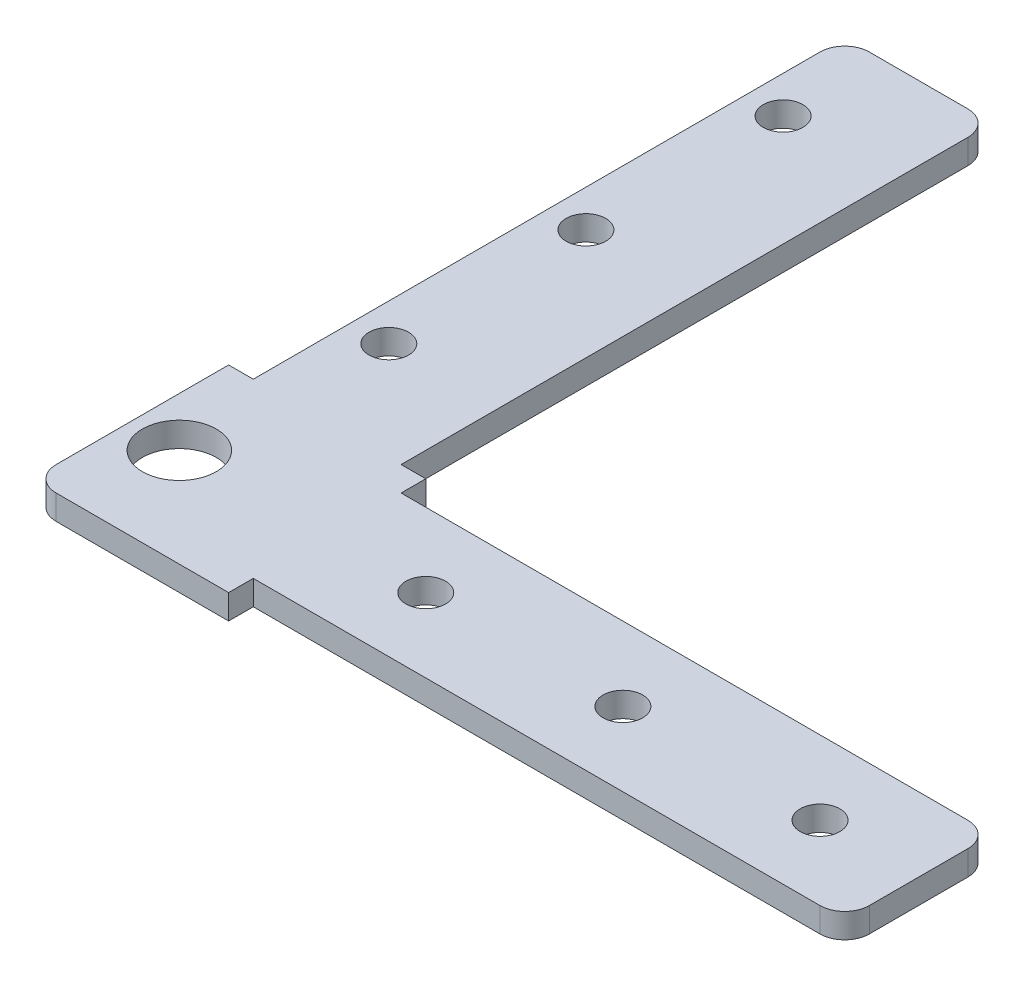
ISO-10303-21;
HEADER;
FILE_DESCRIPTION(('STEP AP214'),'2;1');
FILE_NAME('part.step','',(''),(''),'','','');
FILE_SCHEMA(('AUTOMOTIVE_DESIGN { 1 0 10303 214 1 1 1 1 }'));
ENDSEC;
DATA;
#1=APPLICATION_CONTEXT('core data for automotive mechanical design processes');
#2=APPLICATION_PROTOCOL_DEFINITION('international standard','automotive_design',2000,#1);
#3=PRODUCT_CONTEXT('',#1,'mechanical');
#4=PRODUCT('Part','Part','',(#3));
#5=PRODUCT_RELATED_PRODUCT_CATEGORY('part','',(#4));
#6=PRODUCT_DEFINITION_FORMATION('','',#4);
#7=PRODUCT_DEFINITION_CONTEXT('part definition',#1,'design');
#8=PRODUCT_DEFINITION('design','',#6,#7);
#9=PRODUCT_DEFINITION_SHAPE('','',#8);
#10=(LENGTH_UNIT() NAMED_UNIT(*) SI_UNIT(.MILLI.,.METRE.));
#11=(NAMED_UNIT(*) PLANE_ANGLE_UNIT() SI_UNIT($,.RADIAN.));
#12=(NAMED_UNIT(*) SI_UNIT($,.STERADIAN.) SOLID_ANGLE_UNIT());
#13=UNCERTAINTY_MEASURE_WITH_UNIT(LENGTH_MEASURE(1.E-05),#10,'distance_accuracy_value','');
#14=(GEOMETRIC_REPRESENTATION_CONTEXT(3) GLOBAL_UNCERTAINTY_ASSIGNED_CONTEXT((#13)) GLOBAL_UNIT_ASSIGNED_CONTEXT((#10,
#11,#12)) REPRESENTATION_CONTEXT('',''));
#15=CARTESIAN_POINT('',(0.,0.,0.));
#16=DIRECTION('',(0.,0.,1.));
#17=DIRECTION('',(1.,0.,0.));
#18=AXIS2_PLACEMENT_3D('',#15,#16,#17);
#19=CARTESIAN_POINT('',(25.4,3.175,0.));
#20=DIRECTION('',(0.,0.,-1.));
#21=DIRECTION('',(-1.,0.,0.));
#22=AXIS2_PLACEMENT_3D('',#19,#20,#21);
#23=PLANE('',#22);
#24=DIRECTION('',(1.,0.,0.));
#25=VECTOR('',#24,1.);
#26=CARTESIAN_POINT('',(25.4,3.175,0.));
#27=LINE('',#26,#25);
#28=CARTESIAN_POINT('',(3.175,3.175,0.));
#29=VERTEX_POINT('',#28);
#30=CARTESIAN_POINT('',(25.4,3.175,0.));
#31=VERTEX_POINT('',#30);
#32=EDGE_CURVE('E161',#29,#31,#27,.T.);
#33=ORIENTED_EDGE('',*,*,#32,.F.);
#34=DIRECTION('',(0.,-1.,0.));
#35=VECTOR('',#34,1.);
#36=CARTESIAN_POINT('',(3.175,3.175,0.));
#37=LINE('',#36,#35);
#38=CARTESIAN_POINT('',(3.175,0.,0.));
#39=VERTEX_POINT('',#38);
#40=EDGE_CURVE('E240',#29,#39,#37,.T.);
#41=ORIENTED_EDGE('',*,*,#40,.T.);
#42=DIRECTION('',(1.,0.,0.));
#43=VECTOR('',#42,1.);
#44=CARTESIAN_POINT('',(25.4,0.,0.));
#45=LINE('',#44,#43);
#46=CARTESIAN_POINT('',(25.4,0.,0.));
#47=VERTEX_POINT('',#46);
#48=EDGE_CURVE('E187',#39,#47,#45,.T.);
#49=ORIENTED_EDGE('',*,*,#48,.T.);
#50=DIRECTION('',(0.,-1.,0.));
#51=VECTOR('',#50,1.);
#52=CARTESIAN_POINT('',(25.4,3.175,0.));
#53=LINE('',#52,#51);
#54=EDGE_CURVE('E179',#31,#47,#53,.T.);
#55=ORIENTED_EDGE('',*,*,#54,.F.);
#56=EDGE_LOOP('',(#33,#41,#49,#55));
#57=FACE_BOUND('',#56,.T.);
#58=ADVANCED_FACE('F40',(#57),#23,.F.);
#59=CARTESIAN_POINT('',(25.4,3.175,-3.175));
#60=DIRECTION('',(-1.,0.,0.));
#61=DIRECTION('',(0.,0.,1.));
#62=AXIS2_PLACEMENT_3D('',#59,#60,#61);
#63=PLANE('',#62);
#64=DIRECTION('',(0.,0.,-1.));
#65=VECTOR('',#64,1.);
#66=CARTESIAN_POINT('',(25.4,0.,-3.175));
#67=LINE('',#66,#65);
#68=CARTESIAN_POINT('',(25.4,0.,-3.175));
#69=VERTEX_POINT('',#68);
#70=EDGE_CURVE('E342',#47,#69,#67,.T.);
#71=ORIENTED_EDGE('',*,*,#70,.T.);
#72=DIRECTION('',(0.,-1.,0.));
#73=VECTOR('',#72,1.);
#74=CARTESIAN_POINT('',(25.4,3.175,-3.175));
#75=LINE('',#74,#73);
#76=CARTESIAN_POINT('',(25.4,3.175,-3.175));
#77=VERTEX_POINT('',#76);
#78=EDGE_CURVE('E181',#77,#69,#75,.T.);
#79=ORIENTED_EDGE('',*,*,#78,.F.);
#80=DIRECTION('',(0.,0.,-1.));
#81=VECTOR('',#80,1.);
#82=CARTESIAN_POINT('',(25.4,3.175,-3.175));
#83=LINE('',#82,#81);
#84=EDGE_CURVE('E165',#31,#77,#83,.T.);
#85=ORIENTED_EDGE('',*,*,#84,.F.);
#86=ORIENTED_EDGE('',*,*,#54,.T.);
#87=EDGE_LOOP('',(#71,#79,#85,#86));
#88=FACE_BOUND('',#87,.T.);
#89=ADVANCED_FACE('F178',(#88),#63,.F.);
#90=CARTESIAN_POINT('',(101.6,3.175,-3.175));
#91=DIRECTION('',(0.,0.,-1.));
#92=DIRECTION('',(-1.,0.,0.));
#93=AXIS2_PLACEMENT_3D('',#90,#91,#92);
#94=PLANE('',#93);
#95=DIRECTION('',(1.,0.,0.));
#96=VECTOR('',#95,1.);
#97=CARTESIAN_POINT('',(101.6,0.,-3.175));
#98=LINE('',#97,#96);
#99=CARTESIAN_POINT('',(98.425,0.,-3.175));
#100=VERTEX_POINT('',#99);
#101=EDGE_CURVE('E338',#69,#100,#98,.T.);
#102=ORIENTED_EDGE('',*,*,#101,.T.);
#103=DIRECTION('',(0.,-1.,0.));
#104=VECTOR('',#103,1.);
#105=CARTESIAN_POINT('',(98.425,3.175,-3.175));
#106=LINE('',#105,#104);
#107=CARTESIAN_POINT('',(98.425,3.175,-3.175));
#108=VERTEX_POINT('',#107);
#109=EDGE_CURVE('E220',#100,#108,#106,.F.);
#110=ORIENTED_EDGE('',*,*,#109,.T.);
#111=DIRECTION('',(1.,0.,0.));
#112=VECTOR('',#111,1.);
#113=CARTESIAN_POINT('',(101.6,3.175,-3.175));
#114=LINE('',#113,#112);
#115=EDGE_CURVE('E184',#77,#108,#114,.T.);
#116=ORIENTED_EDGE('',*,*,#115,.F.);
#117=ORIENTED_EDGE('',*,*,#78,.T.);
#118=EDGE_LOOP('',(#102,#110,#116,#117));
#119=FACE_BOUND('',#118,.T.);
#120=ADVANCED_FACE('F468',(#119),#94,.F.);
#121=CARTESIAN_POINT('',(101.6,3.175,-22.225));
#122=DIRECTION('',(-1.,0.,0.));
#123=DIRECTION('',(0.,0.,1.));
#124=AXIS2_PLACEMENT_3D('',#121,#122,#123);
#125=PLANE('',#124);
#126=DIRECTION('',(0.,0.,-1.));
#127=VECTOR('',#126,1.);
#128=CARTESIAN_POINT('',(101.6,3.175,-22.225));
#129=LINE('',#128,#127);
#130=CARTESIAN_POINT('',(101.6,3.175,-6.35));
#131=VERTEX_POINT('',#130);
#132=CARTESIAN_POINT('',(101.6,3.175,-19.05));
#133=VERTEX_POINT('',#132);
#134=EDGE_CURVE('E365',#131,#133,#129,.T.);
#135=ORIENTED_EDGE('',*,*,#134,.F.);
#136=DIRECTION('',(0.,-1.,0.));
#137=VECTOR('',#136,1.);
#138=CARTESIAN_POINT('',(101.6,3.175,-6.35));
#139=LINE('',#138,#137);
#140=CARTESIAN_POINT('',(101.6,0.,-6.35));
#141=VERTEX_POINT('',#140);
#142=EDGE_CURVE('E195',#131,#141,#139,.T.);
#143=ORIENTED_EDGE('',*,*,#142,.T.);
#144=DIRECTION('',(0.,0.,-1.));
#145=VECTOR('',#144,1.);
#146=CARTESIAN_POINT('',(101.6,0.,-22.225));
#147=LINE('',#146,#145);
#148=CARTESIAN_POINT('',(101.6,0.,-19.05));
#149=VERTEX_POINT('',#148);
#150=EDGE_CURVE('E332',#141,#149,#147,.T.);
#151=ORIENTED_EDGE('',*,*,#150,.T.);
#152=DIRECTION('',(0.,-1.,0.));
#153=VECTOR('',#152,1.);
#154=CARTESIAN_POINT('',(101.6,3.175,-19.05));
#155=LINE('',#154,#153);
#156=EDGE_CURVE('E190',#149,#133,#155,.F.);
#157=ORIENTED_EDGE('',*,*,#156,.T.);
#158=EDGE_LOOP('',(#135,#143,#151,#157));
#159=FACE_BOUND('',#158,.T.);
#160=ADVANCED_FACE('F506',(#159),#125,.F.);
#161=CARTESIAN_POINT('',(25.4,3.175,-22.225));
#162=DIRECTION('',(0.,0.,1.));
#163=DIRECTION('',(1.,0.,0.));
#164=AXIS2_PLACEMENT_3D('',#161,#162,#163);
#165=PLANE('',#164);
#166=DIRECTION('',(-1.,0.,0.));
#167=VECTOR('',#166,1.);
#168=CARTESIAN_POINT('',(25.4,3.175,-22.225));
#169=LINE('',#168,#167);
#170=CARTESIAN_POINT('',(98.425,3.175,-22.225));
#171=VERTEX_POINT('',#170);
#172=CARTESIAN_POINT('',(25.4,3.175,-22.225));
#173=VERTEX_POINT('',#172);
#174=EDGE_CURVE('E362',#171,#173,#169,.T.);
#175=ORIENTED_EDGE('',*,*,#174,.F.);
#176=DIRECTION('',(0.,-1.,0.));
#177=VECTOR('',#176,1.);
#178=CARTESIAN_POINT('',(98.425,3.175,-22.225));
#179=LINE('',#178,#177);
#180=CARTESIAN_POINT('',(98.425,0.,-22.225));
#181=VERTEX_POINT('',#180);
#182=EDGE_CURVE('E236',#171,#181,#179,.T.);
#183=ORIENTED_EDGE('',*,*,#182,.T.);
#184=DIRECTION('',(-1.,0.,0.));
#185=VECTOR('',#184,1.);
#186=CARTESIAN_POINT('',(25.4,0.,-22.225));
#187=LINE('',#186,#185);
#188=CARTESIAN_POINT('',(25.4,0.,-22.225));
#189=VERTEX_POINT('',#188);
#190=EDGE_CURVE('E328',#181,#189,#187,.T.);
#191=ORIENTED_EDGE('',*,*,#190,.T.);
#192=DIRECTION('',(0.,-1.,0.));
#193=VECTOR('',#192,1.);
#194=CARTESIAN_POINT('',(25.4,3.175,-22.225));
#195=LINE('',#194,#193);
#196=EDGE_CURVE('E198',#173,#189,#195,.T.);
#197=ORIENTED_EDGE('',*,*,#196,.F.);
#198=EDGE_LOOP('',(#175,#183,#191,#197));
#199=FACE_BOUND('',#198,.T.);
#200=ADVANCED_FACE('F510',(#199),#165,.F.);
#201=CARTESIAN_POINT('',(25.4,3.175,-25.4));
#202=DIRECTION('',(-1.,0.,0.));
#203=DIRECTION('',(0.,0.,1.));
#204=AXIS2_PLACEMENT_3D('',#201,#202,#203);
#205=PLANE('',#204);
#206=DIRECTION('',(0.,0.,-1.));
#207=VECTOR('',#206,1.);
#208=CARTESIAN_POINT('',(25.4,0.,-25.4));
#209=LINE('',#208,#207);
#210=CARTESIAN_POINT('',(25.4,0.,-25.4));
#211=VERTEX_POINT('',#210);
#212=EDGE_CURVE('E322',#189,#211,#209,.T.);
#213=ORIENTED_EDGE('',*,*,#212,.T.);
#214=DIRECTION('',(0.,-1.,0.));
#215=VECTOR('',#214,1.);
#216=CARTESIAN_POINT('',(25.4,3.175,-25.4));
#217=LINE('',#216,#215);
#218=CARTESIAN_POINT('',(25.4,3.175,-25.4));
#219=VERTEX_POINT('',#218);
#220=EDGE_CURVE('E311',#219,#211,#217,.T.);
#221=ORIENTED_EDGE('',*,*,#220,.F.);
#222=DIRECTION('',(0.,0.,-1.));
#223=VECTOR('',#222,1.);
#224=CARTESIAN_POINT('',(25.4,3.175,-25.4));
#225=LINE('',#224,#223);
#226=EDGE_CURVE('E323',#173,#219,#225,.T.);
#227=ORIENTED_EDGE('',*,*,#226,.F.);
#228=ORIENTED_EDGE('',*,*,#196,.T.);
#229=EDGE_LOOP('',(#213,#221,#227,#228));
#230=FACE_BOUND('',#229,.T.);
#231=ADVANCED_FACE('F320',(#230),#205,.F.);
#232=CARTESIAN_POINT('',(22.225,3.175,-25.4));
#233=DIRECTION('',(0.,0.,1.));
#234=DIRECTION('',(1.,0.,0.));
#235=AXIS2_PLACEMENT_3D('',#232,#233,#234);
#236=PLANE('',#235);
#237=DIRECTION('',(-1.,0.,0.));
#238=VECTOR('',#237,1.);
#239=CARTESIAN_POINT('',(22.225,0.,-25.4));
#240=LINE('',#239,#238);
#241=CARTESIAN_POINT('',(22.225,0.,-25.4));
#242=VERTEX_POINT('',#241);
#243=EDGE_CURVE('E291',#211,#242,#240,.T.);
#244=ORIENTED_EDGE('',*,*,#243,.T.);
#245=DIRECTION('',(0.,-1.,0.));
#246=VECTOR('',#245,1.);
#247=CARTESIAN_POINT('',(22.225,3.175,-25.4));
#248=LINE('',#247,#246);
#249=CARTESIAN_POINT('',(22.225,3.175,-25.4));
#250=VERTEX_POINT('',#249);
#251=EDGE_CURVE('E308',#250,#242,#248,.T.);
#252=ORIENTED_EDGE('',*,*,#251,.F.);
#253=DIRECTION('',(-1.,0.,0.));
#254=VECTOR('',#253,1.);
#255=CARTESIAN_POINT('',(22.225,3.175,-25.4));
#256=LINE('',#255,#254);
#257=EDGE_CURVE('E267',#219,#250,#256,.T.);
#258=ORIENTED_EDGE('',*,*,#257,.F.);
#259=ORIENTED_EDGE('',*,*,#220,.T.);
#260=EDGE_LOOP('',(#244,#252,#258,#259));
#261=FACE_BOUND('',#260,.T.);
#262=ADVANCED_FACE('F512',(#261),#236,.F.);
#263=CARTESIAN_POINT('',(22.225,3.175,-101.6));
#264=DIRECTION('',(-1.,0.,0.));
#265=DIRECTION('',(0.,0.,1.));
#266=AXIS2_PLACEMENT_3D('',#263,#264,#265);
#267=PLANE('',#266);
#268=DIRECTION('',(0.,0.,-1.));
#269=VECTOR('',#268,1.);
#270=CARTESIAN_POINT('',(22.225,0.,-101.6));
#271=LINE('',#270,#269);
#272=CARTESIAN_POINT('',(22.225,0.,-98.425));
#273=VERTEX_POINT('',#272);
#274=EDGE_CURVE('E262',#242,#273,#271,.T.);
#275=ORIENTED_EDGE('',*,*,#274,.T.);
#276=DIRECTION('',(0.,-1.,0.));
#277=VECTOR('',#276,1.);
#278=CARTESIAN_POINT('',(22.225,3.175,-98.425));
#279=LINE('',#278,#277);
#280=CARTESIAN_POINT('',(22.225,3.175,-98.425));
#281=VERTEX_POINT('',#280);
#282=EDGE_CURVE('E49',#273,#281,#279,.F.);
#283=ORIENTED_EDGE('',*,*,#282,.T.);
#284=DIRECTION('',(0.,0.,-1.));
#285=VECTOR('',#284,1.);
#286=CARTESIAN_POINT('',(22.225,3.175,-101.6));
#287=LINE('',#286,#285);
#288=EDGE_CURVE('E260',#250,#281,#287,.T.);
#289=ORIENTED_EDGE('',*,*,#288,.F.);
#290=ORIENTED_EDGE('',*,*,#251,.T.);
#291=EDGE_LOOP('',(#275,#283,#289,#290));
#292=FACE_BOUND('',#291,.T.);
#293=ADVANCED_FACE('F258',(#292),#267,.F.);
#294=CARTESIAN_POINT('',(3.175,3.175,-101.6));
#295=DIRECTION('',(0.,0.,1.));
#296=DIRECTION('',(1.,0.,0.));
#297=AXIS2_PLACEMENT_3D('',#294,#295,#296);
#298=PLANE('',#297);
#299=DIRECTION('',(-1.,0.,0.));
#300=VECTOR('',#299,1.);
#301=CARTESIAN_POINT('',(3.175,3.175,-101.6));
#302=LINE('',#301,#300);
#303=CARTESIAN_POINT('',(19.05,3.175,-101.6));
#304=VERTEX_POINT('',#303);
#305=CARTESIAN_POINT('',(6.35,3.175,-101.6));
#306=VERTEX_POINT('',#305);
#307=EDGE_CURVE('E270',#304,#306,#302,.T.);
#308=ORIENTED_EDGE('',*,*,#307,.F.);
#309=DIRECTION('',(0.,-1.,0.));
#310=VECTOR('',#309,1.);
#311=CARTESIAN_POINT('',(19.05,3.175,-101.6));
#312=LINE('',#311,#310);
#313=CARTESIAN_POINT('',(19.05,0.,-101.6));
#314=VERTEX_POINT('',#313);
#315=EDGE_CURVE('E248',#304,#314,#312,.T.);
#316=ORIENTED_EDGE('',*,*,#315,.T.);
#317=DIRECTION('',(-1.,0.,0.));
#318=VECTOR('',#317,1.);
#319=CARTESIAN_POINT('',(3.175,0.,-101.6));
#320=LINE('',#319,#318);
#321=CARTESIAN_POINT('',(6.35,0.,-101.6));
#322=VERTEX_POINT('',#321);
#323=EDGE_CURVE('E278',#314,#322,#320,.T.);
#324=ORIENTED_EDGE('',*,*,#323,.T.);
#325=DIRECTION('',(0.,-1.,0.));
#326=VECTOR('',#325,1.);
#327=CARTESIAN_POINT('',(6.35,3.175,-101.6));
#328=LINE('',#327,#326);
#329=EDGE_CURVE('E245',#322,#306,#328,.F.);
#330=ORIENTED_EDGE('',*,*,#329,.T.);
#331=EDGE_LOOP('',(#308,#316,#324,#330));
#332=FACE_BOUND('',#331,.T.);
#333=ADVANCED_FACE('F277',(#332),#298,.F.);
#334=CARTESIAN_POINT('',(3.175,3.175,-25.4));
#335=DIRECTION('',(1.,0.,0.));
#336=DIRECTION('',(0.,0.,-1.));
#337=AXIS2_PLACEMENT_3D('',#334,#335,#336);
#338=PLANE('',#337);
#339=DIRECTION('',(0.,0.,1.));
#340=VECTOR('',#339,1.);
#341=CARTESIAN_POINT('',(3.175,3.175,-25.4));
#342=LINE('',#341,#340);
#343=CARTESIAN_POINT('',(3.175,3.175,-98.425));
#344=VERTEX_POINT('',#343);
#345=CARTESIAN_POINT('',(3.175,3.175,-25.4));
#346=VERTEX_POINT('',#345);
#347=EDGE_CURVE('E353',#344,#346,#342,.T.);
#348=ORIENTED_EDGE('',*,*,#347,.F.);
#349=DIRECTION('',(0.,-1.,0.));
#350=VECTOR('',#349,1.);
#351=CARTESIAN_POINT('',(3.175,3.175,-98.425));
#352=LINE('',#351,#350);
#353=CARTESIAN_POINT('',(3.175,0.,-98.425));
#354=VERTEX_POINT('',#353);
#355=EDGE_CURVE('E11',#344,#354,#352,.T.);
#356=ORIENTED_EDGE('',*,*,#355,.T.);
#357=DIRECTION('',(0.,0.,1.));
#358=VECTOR('',#357,1.);
#359=CARTESIAN_POINT('',(3.175,0.,-25.4));
#360=LINE('',#359,#358);
#361=CARTESIAN_POINT('',(3.175,0.,-25.4));
#362=VERTEX_POINT('',#361);
#363=EDGE_CURVE('E284',#354,#362,#360,.T.);
#364=ORIENTED_EDGE('',*,*,#363,.T.);
#365=DIRECTION('',(0.,-1.,0.));
#366=VECTOR('',#365,1.);
#367=CARTESIAN_POINT('',(3.175,3.175,-25.4));
#368=LINE('',#367,#366);
#369=EDGE_CURVE('E303',#346,#362,#368,.T.);
#370=ORIENTED_EDGE('',*,*,#369,.F.);
#371=EDGE_LOOP('',(#348,#356,#364,#370));
#372=FACE_BOUND('',#371,.T.);
#373=ADVANCED_FACE('F491',(#372),#338,.F.);
#374=CARTESIAN_POINT('',(0.,3.175,-25.4));
#375=DIRECTION('',(0.,0.,1.));
#376=DIRECTION('',(1.,0.,0.));
#377=AXIS2_PLACEMENT_3D('',#374,#375,#376);
#378=PLANE('',#377);
#379=DIRECTION('',(-1.,0.,0.));
#380=VECTOR('',#379,1.);
#381=CARTESIAN_POINT('',(0.,0.,-25.4));
#382=LINE('',#381,#380);
#383=CARTESIAN_POINT('',(0.,0.,-25.4));
#384=VERTEX_POINT('',#383);
#385=EDGE_CURVE('E288',#362,#384,#382,.T.);
#386=ORIENTED_EDGE('',*,*,#385,.T.);
#387=DIRECTION('',(0.,-1.,0.));
#388=VECTOR('',#387,1.);
#389=CARTESIAN_POINT('',(0.,3.175,-25.4));
#390=LINE('',#389,#388);
#391=CARTESIAN_POINT('',(0.,3.175,-25.4));
#392=VERTEX_POINT('',#391);
#393=EDGE_CURVE('E299',#392,#384,#390,.T.);
#394=ORIENTED_EDGE('',*,*,#393,.F.);
#395=DIRECTION('',(-1.,0.,0.));
#396=VECTOR('',#395,1.);
#397=CARTESIAN_POINT('',(0.,3.175,-25.4));
#398=LINE('',#397,#396);
#399=EDGE_CURVE('E350',#346,#392,#398,.T.);
#400=ORIENTED_EDGE('',*,*,#399,.F.);
#401=ORIENTED_EDGE('',*,*,#369,.T.);
#402=EDGE_LOOP('',(#386,#394,#400,#401));
#403=FACE_BOUND('',#402,.T.);
#404=ADVANCED_FACE('F497',(#403),#378,.F.);
#405=CARTESIAN_POINT('',(0.,3.175,0.));
#406=DIRECTION('',(1.,0.,0.));
#407=DIRECTION('',(0.,0.,-1.));
#408=AXIS2_PLACEMENT_3D('',#405,#406,#407);
#409=PLANE('',#408);
#410=DIRECTION('',(0.,0.,1.));
#411=VECTOR('',#410,1.);
#412=CARTESIAN_POINT('',(0.,0.,0.));
#413=LINE('',#412,#411);
#414=CARTESIAN_POINT('',(0.,0.,-3.175));
#415=VERTEX_POINT('',#414);
#416=EDGE_CURVE('E174',#384,#415,#413,.T.);
#417=ORIENTED_EDGE('',*,*,#416,.T.);
#418=DIRECTION('',(0.,-1.,0.));
#419=VECTOR('',#418,1.);
#420=CARTESIAN_POINT('',(0.,3.175,-3.175));
#421=LINE('',#420,#419);
#422=CARTESIAN_POINT('',(0.,3.175,-3.175));
#423=VERTEX_POINT('',#422);
#424=EDGE_CURVE('E56',#415,#423,#421,.F.);
#425=ORIENTED_EDGE('',*,*,#424,.T.);
#426=DIRECTION('',(0.,0.,1.));
#427=VECTOR('',#426,1.);
#428=CARTESIAN_POINT('',(0.,3.175,0.));
#429=LINE('',#428,#427);
#430=EDGE_CURVE('E304',#392,#423,#429,.T.);
#431=ORIENTED_EDGE('',*,*,#430,.F.);
#432=ORIENTED_EDGE('',*,*,#393,.T.);
#433=EDGE_LOOP('',(#417,#425,#431,#432));
#434=FACE_BOUND('',#433,.T.);
#435=ADVANCED_FACE('F437',(#434),#409,.F.);
#436=CARTESIAN_POINT('',(0.,3.175,0.));
#437=DIRECTION('',(0.,-1.,0.));
#438=DIRECTION('',(0.,0.,-1.));
#439=AXIS2_PLACEMENT_3D('',#436,#437,#438);
#440=PLANE('',#439);
#441=CARTESIAN_POINT('',(6.35,3.175,-12.7));
#442=DIRECTION('',(0.,1.,0.));
#443=DIRECTION('',(0.,0.,1.));
#444=AXIS2_PLACEMENT_3D('',#441,#442,#443);
#445=CIRCLE('',#444,4.7625);
#446=CARTESIAN_POINT('',(6.35,3.175,-7.9375));
#447=VERTEX_POINT('',#446);
#448=EDGE_CURVE('E418',#447,#447,#445,.T.);
#449=ORIENTED_EDGE('',*,*,#448,.F.);
#450=EDGE_LOOP('',(#449));
#451=FACE_BOUND('',#450,.T.);
#452=CARTESIAN_POINT('',(7.9375,3.175,-88.9));
#453=DIRECTION('',(0.,1.,0.));
#454=DIRECTION('',(0.,0.,1.));
#455=AXIS2_PLACEMENT_3D('',#452,#453,#454);
#456=CIRCLE('',#455,2.55269999999999);
#457=CARTESIAN_POINT('',(7.9375,3.175,-86.3473));
#458=VERTEX_POINT('',#457);
#459=EDGE_CURVE('E413',#458,#458,#456,.T.);
#460=ORIENTED_EDGE('',*,*,#459,.F.);
#461=EDGE_LOOP('',(#460));
#462=FACE_BOUND('',#461,.T.);
#463=CARTESIAN_POINT('',(7.93750000000001,3.175,-63.5));
#464=DIRECTION('',(0.,1.,0.));
#465=DIRECTION('',(0.,0.,1.));
#466=AXIS2_PLACEMENT_3D('',#463,#464,#465);
#467=CIRCLE('',#466,2.55269999999999);
#468=CARTESIAN_POINT('',(7.93750000000001,3.175,-60.9473));
#469=VERTEX_POINT('',#468);
#470=EDGE_CURVE('E406',#469,#469,#467,.T.);
#471=ORIENTED_EDGE('',*,*,#470,.F.);
#472=EDGE_LOOP('',(#471));
#473=FACE_BOUND('',#472,.T.);
#474=CARTESIAN_POINT('',(7.93750000000001,3.175,-38.1));
#475=DIRECTION('',(0.,1.,0.));
#476=DIRECTION('',(0.,0.,1.));
#477=AXIS2_PLACEMENT_3D('',#474,#475,#476);
#478=CIRCLE('',#477,2.55269999999999);
#479=CARTESIAN_POINT('',(7.93750000000001,3.175,-35.5473));
#480=VERTEX_POINT('',#479);
#481=EDGE_CURVE('E398',#480,#480,#478,.T.);
#482=ORIENTED_EDGE('',*,*,#481,.F.);
#483=EDGE_LOOP('',(#482));
#484=FACE_BOUND('',#483,.T.);
#485=CARTESIAN_POINT('',(38.1,3.175,-12.7));
#486=DIRECTION('',(0.,1.,0.));
#487=DIRECTION('',(0.,0.,1.));
#488=AXIS2_PLACEMENT_3D('',#485,#486,#487);
#489=CIRCLE('',#488,2.55269999999998);
#490=CARTESIAN_POINT('',(38.1,3.175,-10.1473));
#491=VERTEX_POINT('',#490);
#492=EDGE_CURVE('E390',#491,#491,#489,.T.);
#493=ORIENTED_EDGE('',*,*,#492,.F.);
#494=EDGE_LOOP('',(#493));
#495=FACE_BOUND('',#494,.T.);
#496=CARTESIAN_POINT('',(63.5,3.175,-12.7));
#497=DIRECTION('',(0.,1.,0.));
#498=DIRECTION('',(0.,0.,1.));
#499=AXIS2_PLACEMENT_3D('',#496,#497,#498);
#500=CIRCLE('',#499,2.55269999999999);
#501=CARTESIAN_POINT('',(63.5,3.175,-10.1473));
#502=VERTEX_POINT('',#501);
#503=EDGE_CURVE('E382',#502,#502,#500,.T.);
#504=ORIENTED_EDGE('',*,*,#503,.F.);
#505=EDGE_LOOP('',(#504));
#506=FACE_BOUND('',#505,.T.);
#507=CARTESIAN_POINT('',(88.9,3.175,-12.7));
#508=DIRECTION('',(0.,1.,0.));
#509=DIRECTION('',(0.,0.,1.));
#510=AXIS2_PLACEMENT_3D('',#507,#508,#509);
#511=CIRCLE('',#510,2.55269999999999);
#512=CARTESIAN_POINT('',(88.9,3.175,-10.1473));
#513=VERTEX_POINT('',#512);
#514=EDGE_CURVE('E374',#513,#513,#511,.T.);
#515=ORIENTED_EDGE('',*,*,#514,.F.);
#516=EDGE_LOOP('',(#515));
#517=FACE_BOUND('',#516,.T.);
#518=ORIENTED_EDGE('',*,*,#115,.T.);
#519=CARTESIAN_POINT('',(98.425,3.175,-6.35));
#520=DIRECTION('',(0.,-1.,0.));
#521=DIRECTION('',(0.,0.,-1.));
#522=AXIS2_PLACEMENT_3D('',#519,#520,#521);
#523=CIRCLE('',#522,3.175);
#524=EDGE_CURVE('E233',#108,#131,#523,.F.);
#525=ORIENTED_EDGE('',*,*,#524,.T.);
#526=ORIENTED_EDGE('',*,*,#134,.T.);
#527=CARTESIAN_POINT('',(98.425,3.175,-19.05));
#528=DIRECTION('',(0.,-1.,0.));
#529=DIRECTION('',(0.,0.,-1.));
#530=AXIS2_PLACEMENT_3D('',#527,#528,#529);
#531=CIRCLE('',#530,3.175);
#532=EDGE_CURVE('E230',#133,#171,#531,.F.);
#533=ORIENTED_EDGE('',*,*,#532,.T.);
#534=ORIENTED_EDGE('',*,*,#174,.T.);
#535=ORIENTED_EDGE('',*,*,#226,.T.);
#536=ORIENTED_EDGE('',*,*,#257,.T.);
#537=ORIENTED_EDGE('',*,*,#288,.T.);
#538=CARTESIAN_POINT('',(19.05,3.175,-98.425));
#539=DIRECTION('',(0.,-1.,0.));
#540=DIRECTION('',(0.,0.,-1.));
#541=AXIS2_PLACEMENT_3D('',#538,#539,#540);
#542=CIRCLE('',#541,3.175);
#543=EDGE_CURVE('E225',#281,#304,#542,.F.);
#544=ORIENTED_EDGE('',*,*,#543,.T.);
#545=ORIENTED_EDGE('',*,*,#307,.T.);
#546=CARTESIAN_POINT('',(6.35,3.175,-98.425));
#547=DIRECTION('',(0.,-1.,0.));
#548=DIRECTION('',(0.,0.,-1.));
#549=AXIS2_PLACEMENT_3D('',#546,#547,#548);
#550=CIRCLE('',#549,3.175);
#551=EDGE_CURVE('E64',#306,#344,#550,.F.);
#552=ORIENTED_EDGE('',*,*,#551,.T.);
#553=ORIENTED_EDGE('',*,*,#347,.T.);
#554=ORIENTED_EDGE('',*,*,#399,.T.);
#555=ORIENTED_EDGE('',*,*,#430,.T.);
#556=CARTESIAN_POINT('',(3.175,3.175,-3.175));
#557=DIRECTION('',(0.,-1.,0.));
#558=DIRECTION('',(0.,0.,-1.));
#559=AXIS2_PLACEMENT_3D('',#556,#557,#558);
#560=CIRCLE('',#559,3.175);
#561=EDGE_CURVE('E168',#423,#29,#560,.F.);
#562=ORIENTED_EDGE('',*,*,#561,.T.);
#563=ORIENTED_EDGE('',*,*,#32,.T.);
#564=ORIENTED_EDGE('',*,*,#84,.T.);
#565=EDGE_LOOP('',(#518,#525,#526,#533,#534,#535,#536,#537,#544,#545,#552,#553,#554,#555,#562,
#563,#564));
#566=FACE_BOUND('',#565,.T.);
#567=ADVANCED_FACE('F164',(#451,#462,#473,#484,#495,#506,#517,#566),#440,.F.);
#568=CARTESIAN_POINT('',(0.,0.,0.));
#569=DIRECTION('',(0.,-1.,0.));
#570=DIRECTION('',(0.,0.,-1.));
#571=AXIS2_PLACEMENT_3D('',#568,#569,#570);
#572=PLANE('',#571);
#573=CARTESIAN_POINT('',(6.35,0.,-12.7));
#574=DIRECTION('',(0.,1.,0.));
#575=DIRECTION('',(0.,0.,1.));
#576=AXIS2_PLACEMENT_3D('',#573,#574,#575);
#577=CIRCLE('',#576,4.7625);
#578=CARTESIAN_POINT('',(6.35,0.,-7.9375));
#579=VERTEX_POINT('',#578);
#580=EDGE_CURVE('E417',#579,#579,#577,.T.);
#581=ORIENTED_EDGE('',*,*,#580,.T.);
#582=EDGE_LOOP('',(#581));
#583=FACE_BOUND('',#582,.T.);
#584=CARTESIAN_POINT('',(7.9375,0.,-88.9));
#585=DIRECTION('',(0.,1.,0.));
#586=DIRECTION('',(0.,0.,1.));
#587=AXIS2_PLACEMENT_3D('',#584,#585,#586);
#588=CIRCLE('',#587,2.5527);
#589=CARTESIAN_POINT('',(7.9375,0.,-86.3473));
#590=VERTEX_POINT('',#589);
#591=EDGE_CURVE('E409',#590,#590,#588,.T.);
#592=ORIENTED_EDGE('',*,*,#591,.T.);
#593=EDGE_LOOP('',(#592));
#594=FACE_BOUND('',#593,.T.);
#595=CARTESIAN_POINT('',(7.93750000000001,0.,-63.5));
#596=DIRECTION('',(0.,1.,0.));
#597=DIRECTION('',(0.,0.,1.));
#598=AXIS2_PLACEMENT_3D('',#595,#596,#597);
#599=CIRCLE('',#598,2.5527);
#600=CARTESIAN_POINT('',(7.93750000000001,0.,-60.9473));
#601=VERTEX_POINT('',#600);
#602=EDGE_CURVE('E402',#601,#601,#599,.T.);
#603=ORIENTED_EDGE('',*,*,#602,.T.);
#604=EDGE_LOOP('',(#603));
#605=FACE_BOUND('',#604,.T.);
#606=CARTESIAN_POINT('',(7.93750000000001,0.,-38.1));
#607=DIRECTION('',(0.,1.,0.));
#608=DIRECTION('',(0.,0.,1.));
#609=AXIS2_PLACEMENT_3D('',#606,#607,#608);
#610=CIRCLE('',#609,2.5527);
#611=CARTESIAN_POINT('',(7.93750000000001,0.,-35.5473));
#612=VERTEX_POINT('',#611);
#613=EDGE_CURVE('E394',#612,#612,#610,.T.);
#614=ORIENTED_EDGE('',*,*,#613,.T.);
#615=EDGE_LOOP('',(#614));
#616=FACE_BOUND('',#615,.T.);
#617=CARTESIAN_POINT('',(38.1,0.,-12.7));
#618=DIRECTION('',(0.,1.,0.));
#619=DIRECTION('',(0.,0.,1.));
#620=AXIS2_PLACEMENT_3D('',#617,#618,#619);
#621=CIRCLE('',#620,2.5527);
#622=CARTESIAN_POINT('',(38.1,0.,-10.1473));
#623=VERTEX_POINT('',#622);
#624=EDGE_CURVE('E386',#623,#623,#621,.T.);
#625=ORIENTED_EDGE('',*,*,#624,.T.);
#626=EDGE_LOOP('',(#625));
#627=FACE_BOUND('',#626,.T.);
#628=CARTESIAN_POINT('',(63.5,0.,-12.7));
#629=DIRECTION('',(0.,1.,0.));
#630=DIRECTION('',(0.,0.,1.));
#631=AXIS2_PLACEMENT_3D('',#628,#629,#630);
#632=CIRCLE('',#631,2.55270000000001);
#633=CARTESIAN_POINT('',(63.5,0.,-10.1473));
#634=VERTEX_POINT('',#633);
#635=EDGE_CURVE('E378',#634,#634,#632,.T.);
#636=ORIENTED_EDGE('',*,*,#635,.T.);
#637=EDGE_LOOP('',(#636));
#638=FACE_BOUND('',#637,.T.);
#639=CARTESIAN_POINT('',(88.9,0.,-12.7));
#640=DIRECTION('',(0.,1.,0.));
#641=DIRECTION('',(0.,0.,1.));
#642=AXIS2_PLACEMENT_3D('',#639,#640,#641);
#643=CIRCLE('',#642,2.55270000000001);
#644=CARTESIAN_POINT('',(88.9,0.,-10.1473));
#645=VERTEX_POINT('',#644);
#646=EDGE_CURVE('E347',#645,#645,#643,.T.);
#647=ORIENTED_EDGE('',*,*,#646,.T.);
#648=EDGE_LOOP('',(#647));
#649=FACE_BOUND('',#648,.T.);
#650=ORIENTED_EDGE('',*,*,#150,.F.);
#651=CARTESIAN_POINT('',(98.425,0.,-6.35));
#652=DIRECTION('',(0.,-1.,0.));
#653=DIRECTION('',(0.,0.,-1.));
#654=AXIS2_PLACEMENT_3D('',#651,#652,#653);
#655=CIRCLE('',#654,3.175);
#656=EDGE_CURVE('E217',#141,#100,#655,.T.);
#657=ORIENTED_EDGE('',*,*,#656,.T.);
#658=ORIENTED_EDGE('',*,*,#101,.F.);
#659=ORIENTED_EDGE('',*,*,#70,.F.);
#660=ORIENTED_EDGE('',*,*,#48,.F.);
#661=CARTESIAN_POINT('',(3.175,0.,-3.175));
#662=DIRECTION('',(0.,-1.,0.));
#663=DIRECTION('',(0.,0.,-1.));
#664=AXIS2_PLACEMENT_3D('',#661,#662,#663);
#665=CIRCLE('',#664,3.175);
#666=EDGE_CURVE('E211',#39,#415,#665,.T.);
#667=ORIENTED_EDGE('',*,*,#666,.T.);
#668=ORIENTED_EDGE('',*,*,#416,.F.);
#669=ORIENTED_EDGE('',*,*,#385,.F.);
#670=ORIENTED_EDGE('',*,*,#363,.F.);
#671=CARTESIAN_POINT('',(6.35,0.,-98.425));
#672=DIRECTION('',(0.,-1.,0.));
#673=DIRECTION('',(0.,0.,-1.));
#674=AXIS2_PLACEMENT_3D('',#671,#672,#673);
#675=CIRCLE('',#674,3.175);
#676=EDGE_CURVE('E205',#354,#322,#675,.T.);
#677=ORIENTED_EDGE('',*,*,#676,.T.);
#678=ORIENTED_EDGE('',*,*,#323,.F.);
#679=CARTESIAN_POINT('',(19.05,0.,-98.425));
#680=DIRECTION('',(0.,-1.,0.));
#681=DIRECTION('',(0.,0.,-1.));
#682=AXIS2_PLACEMENT_3D('',#679,#680,#681);
#683=CIRCLE('',#682,3.175);
#684=EDGE_CURVE('E208',#314,#273,#683,.T.);
#685=ORIENTED_EDGE('',*,*,#684,.T.);
#686=ORIENTED_EDGE('',*,*,#274,.F.);
#687=ORIENTED_EDGE('',*,*,#243,.F.);
#688=ORIENTED_EDGE('',*,*,#212,.F.);
#689=ORIENTED_EDGE('',*,*,#190,.F.);
#690=CARTESIAN_POINT('',(98.425,0.,-19.05));
#691=DIRECTION('',(0.,-1.,0.));
#692=DIRECTION('',(0.,0.,-1.));
#693=AXIS2_PLACEMENT_3D('',#690,#691,#692);
#694=CIRCLE('',#693,3.175);
#695=EDGE_CURVE('E214',#181,#149,#694,.T.);
#696=ORIENTED_EDGE('',*,*,#695,.T.);
#697=EDGE_LOOP('',(#650,#657,#658,#659,#660,#667,#668,#669,#670,#677,#678,#685,#686,#687,#688,
#689,#696));
#698=FACE_BOUND('',#697,.T.);
#699=ADVANCED_FACE('F282',(#583,#594,#605,#616,#627,#638,#649,#698),#572,.T.);
#700=CARTESIAN_POINT('',(88.9,3.175,-12.7));
#701=DIRECTION('',(0.,1.,0.));
#702=DIRECTION('',(0.,0.,1.));
#703=AXIS2_PLACEMENT_3D('',#700,#701,#702);
#704=CYLINDRICAL_SURFACE('',#703,2.5527);
#705=ORIENTED_EDGE('',*,*,#646,.F.);
#706=EDGE_LOOP('',(#705));
#707=FACE_BOUND('',#706,.T.);
#708=ORIENTED_EDGE('',*,*,#514,.T.);
#709=EDGE_LOOP('',(#708));
#710=FACE_BOUND('',#709,.T.);
#711=ADVANCED_FACE('F451',(#707,#710),#704,.F.);
#712=CARTESIAN_POINT('',(63.5,3.175,-12.7));
#713=DIRECTION('',(0.,1.,0.));
#714=DIRECTION('',(0.,0.,1.));
#715=AXIS2_PLACEMENT_3D('',#712,#713,#714);
#716=CYLINDRICAL_SURFACE('',#715,2.5527);
#717=ORIENTED_EDGE('',*,*,#635,.F.);
#718=EDGE_LOOP('',(#717));
#719=FACE_BOUND('',#718,.T.);
#720=ORIENTED_EDGE('',*,*,#503,.T.);
#721=EDGE_LOOP('',(#720));
#722=FACE_BOUND('',#721,.T.);
#723=ADVANCED_FACE('F453',(#719,#722),#716,.F.);
#724=CARTESIAN_POINT('',(38.1,3.175,-12.7));
#725=DIRECTION('',(0.,1.,0.));
#726=DIRECTION('',(0.,0.,1.));
#727=AXIS2_PLACEMENT_3D('',#724,#725,#726);
#728=CYLINDRICAL_SURFACE('',#727,2.55269999999999);
#729=ORIENTED_EDGE('',*,*,#624,.F.);
#730=EDGE_LOOP('',(#729));
#731=FACE_BOUND('',#730,.T.);
#732=ORIENTED_EDGE('',*,*,#492,.T.);
#733=EDGE_LOOP('',(#732));
#734=FACE_BOUND('',#733,.T.);
#735=ADVANCED_FACE('F459',(#731,#734),#728,.F.);
#736=CARTESIAN_POINT('',(7.93750000000001,3.175,-38.1));
#737=DIRECTION('',(0.,1.,0.));
#738=DIRECTION('',(0.,0.,1.));
#739=AXIS2_PLACEMENT_3D('',#736,#737,#738);
#740=CYLINDRICAL_SURFACE('',#739,2.55269999999999);
#741=ORIENTED_EDGE('',*,*,#613,.F.);
#742=EDGE_LOOP('',(#741));
#743=FACE_BOUND('',#742,.T.);
#744=ORIENTED_EDGE('',*,*,#481,.T.);
#745=EDGE_LOOP('',(#744));
#746=FACE_BOUND('',#745,.T.);
#747=ADVANCED_FACE('F617',(#743,#746),#740,.F.);
#748=CARTESIAN_POINT('',(7.93750000000001,3.175,-63.5));
#749=DIRECTION('',(0.,1.,0.));
#750=DIRECTION('',(0.,0.,1.));
#751=AXIS2_PLACEMENT_3D('',#748,#749,#750);
#752=CYLINDRICAL_SURFACE('',#751,2.55269999999999);
#753=ORIENTED_EDGE('',*,*,#602,.F.);
#754=EDGE_LOOP('',(#753));
#755=FACE_BOUND('',#754,.T.);
#756=ORIENTED_EDGE('',*,*,#470,.T.);
#757=EDGE_LOOP('',(#756));
#758=FACE_BOUND('',#757,.T.);
#759=ADVANCED_FACE('F626',(#755,#758),#752,.F.);
#760=CARTESIAN_POINT('',(7.9375,3.175,-88.9));
#761=DIRECTION('',(0.,1.,0.));
#762=DIRECTION('',(0.,0.,1.));
#763=AXIS2_PLACEMENT_3D('',#760,#761,#762);
#764=CYLINDRICAL_SURFACE('',#763,2.55269999999999);
#765=ORIENTED_EDGE('',*,*,#591,.F.);
#766=EDGE_LOOP('',(#765));
#767=FACE_BOUND('',#766,.T.);
#768=ORIENTED_EDGE('',*,*,#459,.T.);
#769=EDGE_LOOP('',(#768));
#770=FACE_BOUND('',#769,.T.);
#771=ADVANCED_FACE('F431',(#767,#770),#764,.F.);
#772=CARTESIAN_POINT('',(6.35,0.,-12.7));
#773=DIRECTION('',(0.,1.,0.));
#774=DIRECTION('',(0.,0.,1.));
#775=AXIS2_PLACEMENT_3D('',#772,#773,#774);
#776=CYLINDRICAL_SURFACE('',#775,4.7625);
#777=ORIENTED_EDGE('',*,*,#580,.F.);
#778=EDGE_LOOP('',(#777));
#779=FACE_BOUND('',#778,.T.);
#780=ORIENTED_EDGE('',*,*,#448,.T.);
#781=EDGE_LOOP('',(#780));
#782=FACE_BOUND('',#781,.T.);
#783=ADVANCED_FACE('F427',(#779,#782),#776,.F.);
#784=CARTESIAN_POINT('',(98.425,3.175,-6.35));
#785=DIRECTION('',(0.,-1.,0.));
#786=DIRECTION('',(0.,0.,-1.));
#787=AXIS2_PLACEMENT_3D('',#784,#785,#786);
#788=CYLINDRICAL_SURFACE('',#787,3.175);
#789=ORIENTED_EDGE('',*,*,#524,.F.);
#790=ORIENTED_EDGE('',*,*,#109,.F.);
#791=ORIENTED_EDGE('',*,*,#656,.F.);
#792=ORIENTED_EDGE('',*,*,#142,.F.);
#793=EDGE_LOOP('',(#789,#790,#791,#792));
#794=FACE_BOUND('',#793,.T.);
#795=ADVANCED_FACE('F430',(#794),#788,.T.);
#796=CARTESIAN_POINT('',(98.425,3.175,-19.05));
#797=DIRECTION('',(0.,-1.,0.));
#798=DIRECTION('',(0.,0.,-1.));
#799=AXIS2_PLACEMENT_3D('',#796,#797,#798);
#800=CYLINDRICAL_SURFACE('',#799,3.175);
#801=ORIENTED_EDGE('',*,*,#532,.F.);
#802=ORIENTED_EDGE('',*,*,#156,.F.);
#803=ORIENTED_EDGE('',*,*,#695,.F.);
#804=ORIENTED_EDGE('',*,*,#182,.F.);
#805=EDGE_LOOP('',(#801,#802,#803,#804));
#806=FACE_BOUND('',#805,.T.);
#807=ADVANCED_FACE('F474',(#806),#800,.T.);
#808=CARTESIAN_POINT('',(3.175,3.175,-3.175));
#809=DIRECTION('',(0.,-1.,0.));
#810=DIRECTION('',(0.,0.,-1.));
#811=AXIS2_PLACEMENT_3D('',#808,#809,#810);
#812=CYLINDRICAL_SURFACE('',#811,3.175);
#813=ORIENTED_EDGE('',*,*,#561,.F.);
#814=ORIENTED_EDGE('',*,*,#424,.F.);
#815=ORIENTED_EDGE('',*,*,#666,.F.);
#816=ORIENTED_EDGE('',*,*,#40,.F.);
#817=EDGE_LOOP('',(#813,#814,#815,#816));
#818=FACE_BOUND('',#817,.T.);
#819=ADVANCED_FACE('F478',(#818),#812,.T.);
#820=CARTESIAN_POINT('',(19.05,3.175,-98.425));
#821=DIRECTION('',(0.,-1.,0.));
#822=DIRECTION('',(0.,0.,-1.));
#823=AXIS2_PLACEMENT_3D('',#820,#821,#822);
#824=CYLINDRICAL_SURFACE('',#823,3.175);
#825=ORIENTED_EDGE('',*,*,#543,.F.);
#826=ORIENTED_EDGE('',*,*,#282,.F.);
#827=ORIENTED_EDGE('',*,*,#684,.F.);
#828=ORIENTED_EDGE('',*,*,#315,.F.);
#829=EDGE_LOOP('',(#825,#826,#827,#828));
#830=FACE_BOUND('',#829,.T.);
#831=ADVANCED_FACE('F273',(#830),#824,.T.);
#832=CARTESIAN_POINT('',(6.35,3.175,-98.425));
#833=DIRECTION('',(0.,-1.,0.));
#834=DIRECTION('',(0.,0.,-1.));
#835=AXIS2_PLACEMENT_3D('',#832,#833,#834);
#836=CYLINDRICAL_SURFACE('',#835,3.175);
#837=ORIENTED_EDGE('',*,*,#551,.F.);
#838=ORIENTED_EDGE('',*,*,#329,.F.);
#839=ORIENTED_EDGE('',*,*,#676,.F.);
#840=ORIENTED_EDGE('',*,*,#355,.F.);
#841=EDGE_LOOP('',(#837,#838,#839,#840));
#842=FACE_BOUND('',#841,.T.);
#843=ADVANCED_FACE('F42',(#842),#836,.T.);
#844=CLOSED_SHELL('',(#58,#89,#120,#160,#200,#231,#262,#293,#333,#373,#404,#435,#567,#699,#711,
#723,#735,#747,#759,#771,#783,#795,#807,#819,#831,#843));
#845=MANIFOLD_SOLID_BREP('B2',#844);
#846=ADVANCED_BREP_SHAPE_REPRESENTATION('',(#18,#845),#14);
#847=SHAPE_DEFINITION_REPRESENTATION(#9,#846);
ENDSEC;
END-ISO-10303-21;
